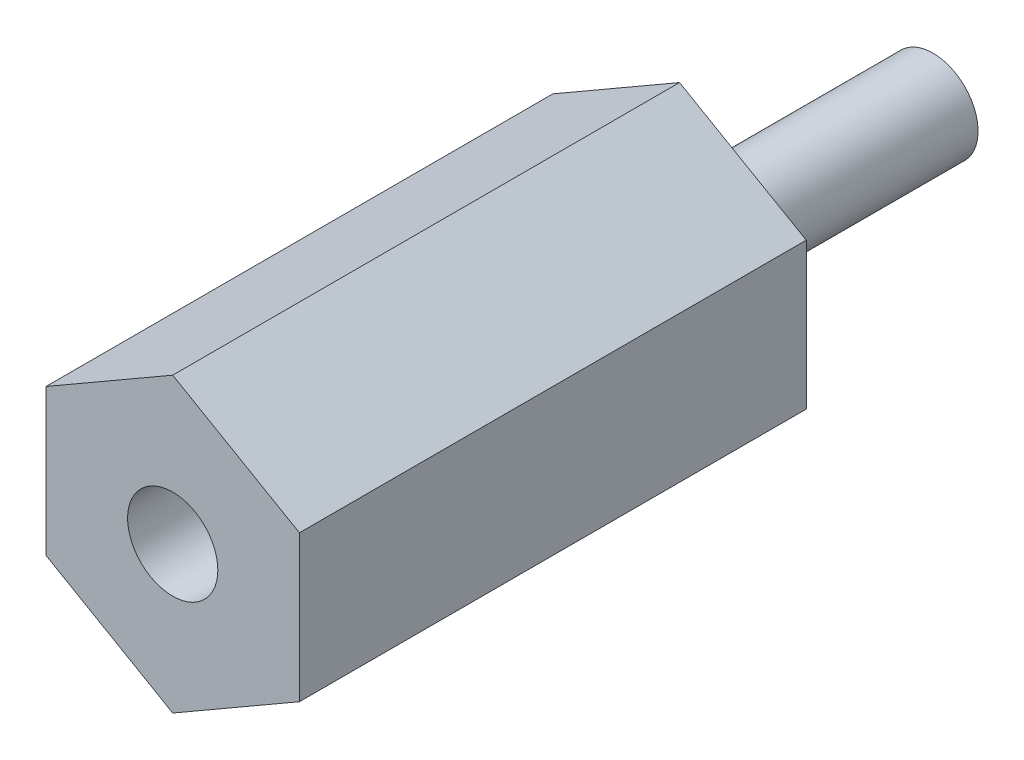
ISO-10303-21;
HEADER;
FILE_DESCRIPTION(('STEP AP214'),'2;1');
FILE_NAME('part.step','',(''),(''),'','','');
FILE_SCHEMA(('AUTOMOTIVE_DESIGN { 1 0 10303 214 1 1 1 1 }'));
ENDSEC;
DATA;
#1=APPLICATION_CONTEXT('core data for automotive mechanical design processes');
#2=APPLICATION_PROTOCOL_DEFINITION('international standard','automotive_design',2000,#1);
#3=PRODUCT_CONTEXT('',#1,'mechanical');
#4=PRODUCT('Part','Part','',(#3));
#5=PRODUCT_RELATED_PRODUCT_CATEGORY('part','',(#4));
#6=PRODUCT_DEFINITION_FORMATION('','',#4);
#7=PRODUCT_DEFINITION_CONTEXT('part definition',#1,'design');
#8=PRODUCT_DEFINITION('design','',#6,#7);
#9=PRODUCT_DEFINITION_SHAPE('','',#8);
#10=(LENGTH_UNIT() NAMED_UNIT(*) SI_UNIT(.MILLI.,.METRE.));
#11=(NAMED_UNIT(*) PLANE_ANGLE_UNIT() SI_UNIT($,.RADIAN.));
#12=(NAMED_UNIT(*) SI_UNIT($,.STERADIAN.) SOLID_ANGLE_UNIT());
#13=UNCERTAINTY_MEASURE_WITH_UNIT(LENGTH_MEASURE(1.E-05),#10,'distance_accuracy_value','');
#14=(GEOMETRIC_REPRESENTATION_CONTEXT(3) GLOBAL_UNCERTAINTY_ASSIGNED_CONTEXT((#13)) GLOBAL_UNIT_ASSIGNED_CONTEXT((#10,
#11,#12)) REPRESENTATION_CONTEXT('',''));
#15=CARTESIAN_POINT('',(0.,0.,0.));
#16=DIRECTION('',(0.,0.,1.));
#17=DIRECTION('',(1.,0.,0.));
#18=AXIS2_PLACEMENT_3D('',#15,#16,#17);
#19=CARTESIAN_POINT('',(0.,0.,-6.35));
#20=DIRECTION('',(0.,0.,1.));
#21=DIRECTION('',(1.,0.,0.));
#22=AXIS2_PLACEMENT_3D('',#19,#20,#21);
#23=CYLINDRICAL_SURFACE('',#22,1.13029999999999);
#24=CARTESIAN_POINT('',(0.,0.,-6.35));
#25=DIRECTION('',(0.,0.,-1.));
#26=DIRECTION('',(-1.,0.,0.));
#27=AXIS2_PLACEMENT_3D('',#24,#25,#26);
#28=CIRCLE('',#27,1.13029999999999);
#29=CARTESIAN_POINT('',(-1.13029999999999,0.,-6.35));
#30=VERTEX_POINT('',#29);
#31=EDGE_CURVE('E11',#30,#30,#28,.T.);
#32=ORIENTED_EDGE('',*,*,#31,.F.);
#33=EDGE_LOOP('',(#32));
#34=FACE_BOUND('',#33,.T.);
#35=CARTESIAN_POINT('',(0.,0.,0.));
#36=DIRECTION('',(0.,0.,-1.));
#37=DIRECTION('',(-1.,0.,0.));
#38=AXIS2_PLACEMENT_3D('',#35,#36,#37);
#39=CIRCLE('',#38,1.13029999999999);
#40=CARTESIAN_POINT('',(-1.13029999999999,0.,0.));
#41=VERTEX_POINT('',#40);
#42=EDGE_CURVE('E43',#41,#41,#39,.T.);
#43=ORIENTED_EDGE('',*,*,#42,.T.);
#44=EDGE_LOOP('',(#43));
#45=FACE_BOUND('',#44,.T.);
#46=ADVANCED_FACE('F40',(#34,#45),#23,.T.);
#47=CARTESIAN_POINT('',(0.,0.,-6.35));
#48=DIRECTION('',(0.,0.,-1.));
#49=DIRECTION('',(-1.,0.,0.));
#50=AXIS2_PLACEMENT_3D('',#47,#48,#49);
#51=PLANE('',#50);
#52=ORIENTED_EDGE('',*,*,#31,.T.);
#53=EDGE_LOOP('',(#52));
#54=FACE_BOUND('',#53,.T.);
#55=ADVANCED_FACE('F55',(#54),#51,.T.);
#56=CARTESIAN_POINT('',(0.,0.,0.));
#57=DIRECTION('',(0.,0.,-1.));
#58=DIRECTION('',(-1.,0.,0.));
#59=AXIS2_PLACEMENT_3D('',#56,#57,#58);
#60=PLANE('',#59);
#61=ORIENTED_EDGE('',*,*,#42,.F.);
#62=EDGE_LOOP('',(#61));
#63=FACE_BOUND('',#62,.T.);
#64=ADVANCED_FACE('F53',(#63),#60,.F.);
#65=CLOSED_SHELL('',(#46,#55,#64));
#66=MANIFOLD_SOLID_BREP('B2',#65);
#67=CARTESIAN_POINT('',(3.17499999999998,1.8330871046771,12.7));
#68=DIRECTION('',(-0.499999999999995,-0.866025403784442,0.));
#69=DIRECTION('',(0.866025403784442,-0.499999999999995,0.));
#70=AXIS2_PLACEMENT_3D('',#67,#68,#69);
#71=PLANE('',#70);
#72=DIRECTION('',(-0.866025403784442,0.499999999999995,0.));
#73=VECTOR('',#72,1.);
#74=CARTESIAN_POINT('',(3.17499999999998,1.8330871046771,0.));
#75=LINE('',#74,#73);
#76=CARTESIAN_POINT('',(3.17499999999998,1.8330871046771,0.));
#77=VERTEX_POINT('',#76);
#78=CARTESIAN_POINT('',(0.,3.66617420935413,0.));
#79=VERTEX_POINT('',#78);
#80=EDGE_CURVE('E164',#77,#79,#75,.T.);
#81=ORIENTED_EDGE('',*,*,#80,.T.);
#82=DIRECTION('',(0.,0.,-1.));
#83=VECTOR('',#82,1.);
#84=CARTESIAN_POINT('',(0.,3.66617420935413,12.7));
#85=LINE('',#84,#83);
#86=CARTESIAN_POINT('',(0.,3.66617420935413,12.7));
#87=VERTEX_POINT('',#86);
#88=EDGE_CURVE('E38',#87,#79,#85,.T.);
#89=ORIENTED_EDGE('',*,*,#88,.F.);
#90=DIRECTION('',(-0.866025403784442,0.499999999999995,0.));
#91=VECTOR('',#90,1.);
#92=CARTESIAN_POINT('',(3.17499999999998,1.8330871046771,12.7));
#93=LINE('',#92,#91);
#94=CARTESIAN_POINT('',(3.17499999999998,1.8330871046771,12.7));
#95=VERTEX_POINT('',#94);
#96=EDGE_CURVE('E175',#95,#87,#93,.T.);
#97=ORIENTED_EDGE('',*,*,#96,.F.);
#98=DIRECTION('',(0.,0.,-1.));
#99=VECTOR('',#98,1.);
#100=CARTESIAN_POINT('',(3.17499999999998,1.8330871046771,12.7));
#101=LINE('',#100,#99);
#102=EDGE_CURVE('E160',#95,#77,#101,.T.);
#103=ORIENTED_EDGE('',*,*,#102,.T.);
#104=EDGE_LOOP('',(#81,#89,#97,#103));
#105=FACE_BOUND('',#104,.T.);
#106=ADVANCED_FACE('F80',(#105),#71,.F.);
#107=CARTESIAN_POINT('',(0.,3.66617420935413,12.7));
#108=DIRECTION('',(0.500000000000001,-0.866025403784438,0.));
#109=DIRECTION('',(0.866025403784438,0.500000000000001,0.));
#110=AXIS2_PLACEMENT_3D('',#107,#108,#109);
#111=PLANE('',#110);
#112=DIRECTION('',(-0.866025403784438,-0.500000000000001,0.));
#113=VECTOR('',#112,1.);
#114=CARTESIAN_POINT('',(0.,3.66617420935413,0.));
#115=LINE('',#114,#113);
#116=CARTESIAN_POINT('',(-3.17500000000001,1.83308710467706,0.));
#117=VERTEX_POINT('',#116);
#118=EDGE_CURVE('E167',#79,#117,#115,.T.);
#119=ORIENTED_EDGE('',*,*,#118,.T.);
#120=DIRECTION('',(0.,0.,-1.));
#121=VECTOR('',#120,1.);
#122=CARTESIAN_POINT('',(-3.17500000000001,1.83308710467706,12.7));
#123=LINE('',#122,#121);
#124=CARTESIAN_POINT('',(-3.17500000000001,1.83308710467706,12.7));
#125=VERTEX_POINT('',#124);
#126=EDGE_CURVE('E88',#125,#117,#123,.T.);
#127=ORIENTED_EDGE('',*,*,#126,.F.);
#128=DIRECTION('',(-0.866025403784438,-0.500000000000001,0.));
#129=VECTOR('',#128,1.);
#130=CARTESIAN_POINT('',(0.,3.66617420935413,12.7));
#131=LINE('',#130,#129);
#132=EDGE_CURVE('E133',#87,#125,#131,.T.);
#133=ORIENTED_EDGE('',*,*,#132,.F.);
#134=ORIENTED_EDGE('',*,*,#88,.T.);
#135=EDGE_LOOP('',(#119,#127,#133,#134));
#136=FACE_BOUND('',#135,.T.);
#137=ADVANCED_FACE('F200',(#136),#111,.F.);
#138=CARTESIAN_POINT('',(-3.17500000000001,1.83308710467706,12.7));
#139=DIRECTION('',(1.,0.,0.));
#140=DIRECTION('',(0.,1.,0.));
#141=AXIS2_PLACEMENT_3D('',#138,#139,#140);
#142=PLANE('',#141);
#143=DIRECTION('',(0.,-1.,0.));
#144=VECTOR('',#143,1.);
#145=CARTESIAN_POINT('',(-3.17500000000001,1.83308710467706,0.));
#146=LINE('',#145,#144);
#147=CARTESIAN_POINT('',(-3.17499999999999,-1.83308710467708,0.));
#148=VERTEX_POINT('',#147);
#149=EDGE_CURVE('E170',#117,#148,#146,.T.);
#150=ORIENTED_EDGE('',*,*,#149,.T.);
#151=DIRECTION('',(0.,0.,-1.));
#152=VECTOR('',#151,1.);
#153=CARTESIAN_POINT('',(-3.17499999999999,-1.83308710467708,12.7));
#154=LINE('',#153,#152);
#155=CARTESIAN_POINT('',(-3.17499999999999,-1.83308710467708,12.7));
#156=VERTEX_POINT('',#155);
#157=EDGE_CURVE('E155',#156,#148,#154,.T.);
#158=ORIENTED_EDGE('',*,*,#157,.F.);
#159=DIRECTION('',(0.,-1.,0.));
#160=VECTOR('',#159,1.);
#161=CARTESIAN_POINT('',(-3.17500000000001,1.83308710467706,12.7));
#162=LINE('',#161,#160);
#163=EDGE_CURVE('E146',#125,#156,#162,.T.);
#164=ORIENTED_EDGE('',*,*,#163,.F.);
#165=ORIENTED_EDGE('',*,*,#126,.T.);
#166=EDGE_LOOP('',(#150,#158,#164,#165));
#167=FACE_BOUND('',#166,.T.);
#168=ADVANCED_FACE('F181',(#167),#142,.F.);
#169=CARTESIAN_POINT('',(-3.17499999999999,-1.83308710467708,12.7));
#170=DIRECTION('',(0.499999999999995,0.866025403784441,0.));
#171=DIRECTION('',(-0.866025403784442,0.499999999999995,0.));
#172=AXIS2_PLACEMENT_3D('',#169,#170,#171);
#173=PLANE('',#172);
#174=DIRECTION('',(0.866025403784442,-0.499999999999995,0.));
#175=VECTOR('',#174,1.);
#176=CARTESIAN_POINT('',(-3.17499999999999,-1.83308710467708,0.));
#177=LINE('',#176,#175);
#178=CARTESIAN_POINT('',(0.,-3.66617420935413,0.));
#179=VERTEX_POINT('',#178);
#180=EDGE_CURVE('E154',#148,#179,#177,.T.);
#181=ORIENTED_EDGE('',*,*,#180,.T.);
#182=DIRECTION('',(0.,0.,-1.));
#183=VECTOR('',#182,1.);
#184=CARTESIAN_POINT('',(0.,-3.66617420935413,12.7));
#185=LINE('',#184,#183);
#186=CARTESIAN_POINT('',(0.,-3.66617420935413,12.7));
#187=VERTEX_POINT('',#186);
#188=EDGE_CURVE('E151',#187,#179,#185,.T.);
#189=ORIENTED_EDGE('',*,*,#188,.F.);
#190=DIRECTION('',(0.866025403784442,-0.499999999999995,0.));
#191=VECTOR('',#190,1.);
#192=CARTESIAN_POINT('',(-3.17499999999999,-1.83308710467708,12.7));
#193=LINE('',#192,#191);
#194=EDGE_CURVE('E140',#156,#187,#193,.T.);
#195=ORIENTED_EDGE('',*,*,#194,.F.);
#196=ORIENTED_EDGE('',*,*,#157,.T.);
#197=EDGE_LOOP('',(#181,#189,#195,#196));
#198=FACE_BOUND('',#197,.T.);
#199=ADVANCED_FACE('F152',(#198),#173,.F.);
#200=CARTESIAN_POINT('',(0.,-3.66617420935413,12.7));
#201=DIRECTION('',(-0.500000000000007,0.866025403784434,0.));
#202=DIRECTION('',(-0.866025403784435,-0.500000000000007,0.));
#203=AXIS2_PLACEMENT_3D('',#200,#201,#202);
#204=PLANE('',#203);
#205=DIRECTION('',(0.866025403784435,0.500000000000007,0.));
#206=VECTOR('',#205,1.);
#207=CARTESIAN_POINT('',(0.,-3.66617420935413,0.));
#208=LINE('',#207,#206);
#209=CARTESIAN_POINT('',(3.17500000000002,-1.83308710467703,0.));
#210=VERTEX_POINT('',#209);
#211=EDGE_CURVE('E119',#179,#210,#208,.T.);
#212=ORIENTED_EDGE('',*,*,#211,.T.);
#213=DIRECTION('',(0.,0.,-1.));
#214=VECTOR('',#213,1.);
#215=CARTESIAN_POINT('',(3.17500000000002,-1.83308710467703,12.7));
#216=LINE('',#215,#214);
#217=CARTESIAN_POINT('',(3.17500000000002,-1.83308710467703,12.7));
#218=VERTEX_POINT('',#217);
#219=EDGE_CURVE('E156',#218,#210,#216,.T.);
#220=ORIENTED_EDGE('',*,*,#219,.F.);
#221=DIRECTION('',(0.866025403784435,0.500000000000007,0.));
#222=VECTOR('',#221,1.);
#223=CARTESIAN_POINT('',(0.,-3.66617420935413,12.7));
#224=LINE('',#223,#222);
#225=EDGE_CURVE('E144',#187,#218,#224,.T.);
#226=ORIENTED_EDGE('',*,*,#225,.F.);
#227=ORIENTED_EDGE('',*,*,#188,.T.);
#228=EDGE_LOOP('',(#212,#220,#226,#227));
#229=FACE_BOUND('',#228,.T.);
#230=ADVANCED_FACE('F158',(#229),#204,.F.);
#231=CARTESIAN_POINT('',(3.17500000000002,-1.83308710467703,12.7));
#232=DIRECTION('',(-1.,0.,0.));
#233=DIRECTION('',(0.,-1.,0.));
#234=AXIS2_PLACEMENT_3D('',#231,#232,#233);
#235=PLANE('',#234);
#236=DIRECTION('',(0.,1.,0.));
#237=VECTOR('',#236,1.);
#238=CARTESIAN_POINT('',(3.17500000000002,-1.83308710467703,0.));
#239=LINE('',#238,#237);
#240=EDGE_CURVE('E125',#210,#77,#239,.T.);
#241=ORIENTED_EDGE('',*,*,#240,.T.);
#242=ORIENTED_EDGE('',*,*,#102,.F.);
#243=DIRECTION('',(0.,1.,0.));
#244=VECTOR('',#243,1.);
#245=CARTESIAN_POINT('',(3.17500000000002,-1.83308710467703,12.7));
#246=LINE('',#245,#244);
#247=EDGE_CURVE('E96',#218,#95,#246,.T.);
#248=ORIENTED_EDGE('',*,*,#247,.F.);
#249=ORIENTED_EDGE('',*,*,#219,.T.);
#250=EDGE_LOOP('',(#241,#242,#248,#249));
#251=FACE_BOUND('',#250,.T.);
#252=ADVANCED_FACE('F188',(#251),#235,.F.);
#253=CARTESIAN_POINT('',(0.,0.,12.7));
#254=DIRECTION('',(0.,0.,1.));
#255=DIRECTION('',(1.,0.,0.));
#256=AXIS2_PLACEMENT_3D('',#253,#254,#255);
#257=PLANE('',#256);
#258=CARTESIAN_POINT('',(0.,0.,12.7));
#259=DIRECTION('',(0.,0.,1.));
#260=DIRECTION('',(1.,0.,0.));
#261=AXIS2_PLACEMENT_3D('',#258,#259,#260);
#262=CIRCLE('',#261,1.13029999999999);
#263=CARTESIAN_POINT('',(1.13029999999999,0.,12.7));
#264=VERTEX_POINT('',#263);
#265=EDGE_CURVE('E255',#264,#264,#262,.T.);
#266=ORIENTED_EDGE('',*,*,#265,.F.);
#267=EDGE_LOOP('',(#266));
#268=FACE_BOUND('',#267,.T.);
#269=ORIENTED_EDGE('',*,*,#96,.T.);
#270=ORIENTED_EDGE('',*,*,#132,.T.);
#271=ORIENTED_EDGE('',*,*,#163,.T.);
#272=ORIENTED_EDGE('',*,*,#194,.T.);
#273=ORIENTED_EDGE('',*,*,#225,.T.);
#274=ORIENTED_EDGE('',*,*,#247,.T.);
#275=EDGE_LOOP('',(#269,#270,#271,#272,#273,#274));
#276=FACE_BOUND('',#275,.T.);
#277=ADVANCED_FACE('F142',(#268,#276),#257,.T.);
#278=CARTESIAN_POINT('',(0.,0.,0.));
#279=DIRECTION('',(0.,0.,1.));
#280=DIRECTION('',(1.,0.,0.));
#281=AXIS2_PLACEMENT_3D('',#278,#279,#280);
#282=PLANE('',#281);
#283=CARTESIAN_POINT('',(0.,0.,0.));
#284=DIRECTION('',(0.,0.,1.));
#285=DIRECTION('',(1.,0.,0.));
#286=AXIS2_PLACEMENT_3D('',#283,#284,#285);
#287=CIRCLE('',#286,1.1303);
#288=CARTESIAN_POINT('',(1.1303,0.,0.));
#289=VERTEX_POINT('',#288);
#290=EDGE_CURVE('E168',#289,#289,#287,.T.);
#291=ORIENTED_EDGE('',*,*,#290,.T.);
#292=EDGE_LOOP('',(#291));
#293=FACE_BOUND('',#292,.T.);
#294=ORIENTED_EDGE('',*,*,#80,.F.);
#295=ORIENTED_EDGE('',*,*,#240,.F.);
#296=ORIENTED_EDGE('',*,*,#211,.F.);
#297=ORIENTED_EDGE('',*,*,#180,.F.);
#298=ORIENTED_EDGE('',*,*,#149,.F.);
#299=ORIENTED_EDGE('',*,*,#118,.F.);
#300=EDGE_LOOP('',(#294,#295,#296,#297,#298,#299));
#301=FACE_BOUND('',#300,.T.);
#302=ADVANCED_FACE('F184',(#293,#301),#282,.F.);
#303=CARTESIAN_POINT('',(0.,0.,12.7));
#304=DIRECTION('',(0.,0.,1.));
#305=DIRECTION('',(1.,0.,0.));
#306=AXIS2_PLACEMENT_3D('',#303,#304,#305);
#307=CYLINDRICAL_SURFACE('',#306,1.13029999999999);
#308=ORIENTED_EDGE('',*,*,#290,.F.);
#309=EDGE_LOOP('',(#308));
#310=FACE_BOUND('',#309,.T.);
#311=ORIENTED_EDGE('',*,*,#265,.T.);
#312=EDGE_LOOP('',(#311));
#313=FACE_BOUND('',#312,.T.);
#314=ADVANCED_FACE('F237',(#310,#313),#307,.F.);
#315=CLOSED_SHELL('',(#106,#137,#168,#199,#230,#252,#277,#302,#314));
#316=MANIFOLD_SOLID_BREP('B6',#315);
#317=ADVANCED_BREP_SHAPE_REPRESENTATION('',(#18,#66,#316),#14);
#318=SHAPE_DEFINITION_REPRESENTATION(#9,#317);
ENDSEC;
END-ISO-10303-21;
